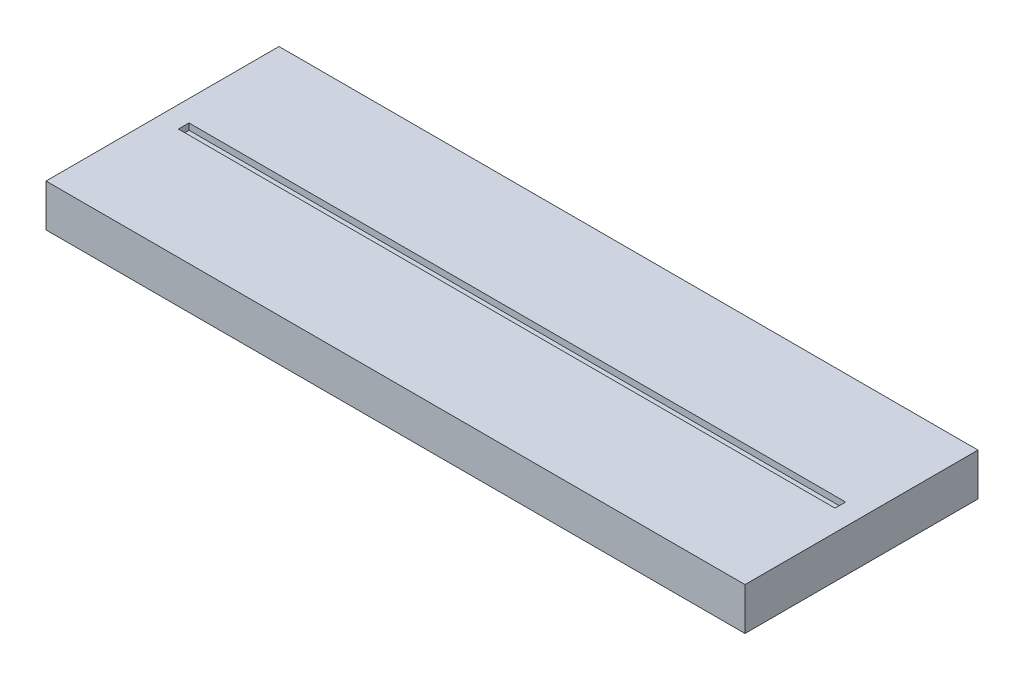
ISO-10303-21;
HEADER;
FILE_DESCRIPTION(('STEP AP214'),'2;1');
FILE_NAME('part.step','',(''),(''),'','','');
FILE_SCHEMA(('AUTOMOTIVE_DESIGN { 1 0 10303 214 1 1 1 1 }'));
ENDSEC;
DATA;
#1=APPLICATION_CONTEXT('core data for automotive mechanical design processes');
#2=APPLICATION_PROTOCOL_DEFINITION('international standard','automotive_design',2000,#1);
#3=PRODUCT_CONTEXT('',#1,'mechanical');
#4=PRODUCT('Part','Part','',(#3));
#5=PRODUCT_RELATED_PRODUCT_CATEGORY('part','',(#4));
#6=PRODUCT_DEFINITION_FORMATION('','',#4);
#7=PRODUCT_DEFINITION_CONTEXT('part definition',#1,'design');
#8=PRODUCT_DEFINITION('design','',#6,#7);
#9=PRODUCT_DEFINITION_SHAPE('','',#8);
#10=(LENGTH_UNIT() NAMED_UNIT(*) SI_UNIT(.MILLI.,.METRE.));
#11=(NAMED_UNIT(*) PLANE_ANGLE_UNIT() SI_UNIT($,.RADIAN.));
#12=(NAMED_UNIT(*) SI_UNIT($,.STERADIAN.) SOLID_ANGLE_UNIT());
#13=UNCERTAINTY_MEASURE_WITH_UNIT(LENGTH_MEASURE(1.E-05),#10,'distance_accuracy_value','');
#14=(GEOMETRIC_REPRESENTATION_CONTEXT(3) GLOBAL_UNCERTAINTY_ASSIGNED_CONTEXT((#13)) GLOBAL_UNIT_ASSIGNED_CONTEXT((#10,
#11,#12)) REPRESENTATION_CONTEXT('',''));
#15=CARTESIAN_POINT('',(0.,0.,0.));
#16=DIRECTION('',(0.,0.,1.));
#17=DIRECTION('',(1.,0.,0.));
#18=AXIS2_PLACEMENT_3D('',#15,#16,#17);
#19=CARTESIAN_POINT('',(82.5,10.,27.5));
#20=DIRECTION('',(-1.,0.,0.));
#21=DIRECTION('',(0.,0.,1.));
#22=AXIS2_PLACEMENT_3D('',#19,#20,#21);
#23=PLANE('',#22);
#24=DIRECTION('',(0.,0.,-1.));
#25=VECTOR('',#24,1.);
#26=CARTESIAN_POINT('',(82.5,0.,27.5));
#27=LINE('',#26,#25);
#28=CARTESIAN_POINT('',(82.5,0.,27.5));
#29=VERTEX_POINT('',#28);
#30=CARTESIAN_POINT('',(82.5,0.,-27.5));
#31=VERTEX_POINT('',#30);
#32=EDGE_CURVE('E163',#29,#31,#27,.T.);
#33=ORIENTED_EDGE('',*,*,#32,.T.);
#34=DIRECTION('',(0.,-1.,0.));
#35=VECTOR('',#34,1.);
#36=CARTESIAN_POINT('',(82.5,10.,-27.5));
#37=LINE('',#36,#35);
#38=CARTESIAN_POINT('',(82.5,10.,-27.5));
#39=VERTEX_POINT('',#38);
#40=EDGE_CURVE('E11',#39,#31,#37,.T.);
#41=ORIENTED_EDGE('',*,*,#40,.F.);
#42=DIRECTION('',(0.,0.,-1.));
#43=VECTOR('',#42,1.);
#44=CARTESIAN_POINT('',(82.5,10.,27.5));
#45=LINE('',#44,#43);
#46=CARTESIAN_POINT('',(82.5,10.,27.5));
#47=VERTEX_POINT('',#46);
#48=EDGE_CURVE('E168',#47,#39,#45,.T.);
#49=ORIENTED_EDGE('',*,*,#48,.F.);
#50=DIRECTION('',(0.,-1.,0.));
#51=VECTOR('',#50,1.);
#52=CARTESIAN_POINT('',(82.5,10.,27.5));
#53=LINE('',#52,#51);
#54=EDGE_CURVE('E176',#47,#29,#53,.T.);
#55=ORIENTED_EDGE('',*,*,#54,.T.);
#56=EDGE_LOOP('',(#33,#41,#49,#55));
#57=FACE_BOUND('',#56,.T.);
#58=ADVANCED_FACE('F44',(#57),#23,.F.);
#59=CARTESIAN_POINT('',(-82.5,10.,-27.5));
#60=DIRECTION('',(0.,0.,1.));
#61=DIRECTION('',(1.,0.,0.));
#62=AXIS2_PLACEMENT_3D('',#59,#60,#61);
#63=PLANE('',#62);
#64=DIRECTION('',(-1.,0.,0.));
#65=VECTOR('',#64,1.);
#66=CARTESIAN_POINT('',(-82.5,0.,-27.5));
#67=LINE('',#66,#65);
#68=CARTESIAN_POINT('',(-82.5,0.,-27.5));
#69=VERTEX_POINT('',#68);
#70=EDGE_CURVE('E184',#31,#69,#67,.T.);
#71=ORIENTED_EDGE('',*,*,#70,.T.);
#72=DIRECTION('',(0.,-1.,0.));
#73=VECTOR('',#72,1.);
#74=CARTESIAN_POINT('',(-82.5,10.,-27.5));
#75=LINE('',#74,#73);
#76=CARTESIAN_POINT('',(-82.5,10.,-27.5));
#77=VERTEX_POINT('',#76);
#78=EDGE_CURVE('E52',#77,#69,#75,.T.);
#79=ORIENTED_EDGE('',*,*,#78,.F.);
#80=DIRECTION('',(-1.,0.,0.));
#81=VECTOR('',#80,1.);
#82=CARTESIAN_POINT('',(-82.5,10.,-27.5));
#83=LINE('',#82,#81);
#84=EDGE_CURVE('E100',#39,#77,#83,.T.);
#85=ORIENTED_EDGE('',*,*,#84,.F.);
#86=ORIENTED_EDGE('',*,*,#40,.T.);
#87=EDGE_LOOP('',(#71,#79,#85,#86));
#88=FACE_BOUND('',#87,.T.);
#89=ADVANCED_FACE('F219',(#88),#63,.F.);
#90=CARTESIAN_POINT('',(-82.5,10.,27.5));
#91=DIRECTION('',(1.,0.,0.));
#92=DIRECTION('',(0.,0.,-1.));
#93=AXIS2_PLACEMENT_3D('',#90,#91,#92);
#94=PLANE('',#93);
#95=DIRECTION('',(0.,0.,1.));
#96=VECTOR('',#95,1.);
#97=CARTESIAN_POINT('',(-82.5,0.,27.5));
#98=LINE('',#97,#96);
#99=CARTESIAN_POINT('',(-82.5,0.,27.5));
#100=VERTEX_POINT('',#99);
#101=EDGE_CURVE('E186',#69,#100,#98,.T.);
#102=ORIENTED_EDGE('',*,*,#101,.T.);
#103=DIRECTION('',(0.,-1.,0.));
#104=VECTOR('',#103,1.);
#105=CARTESIAN_POINT('',(-82.5,10.,27.5));
#106=LINE('',#105,#104);
#107=CARTESIAN_POINT('',(-82.5,10.,27.5));
#108=VERTEX_POINT('',#107);
#109=EDGE_CURVE('E194',#108,#100,#106,.T.);
#110=ORIENTED_EDGE('',*,*,#109,.F.);
#111=DIRECTION('',(0.,0.,1.));
#112=VECTOR('',#111,1.);
#113=CARTESIAN_POINT('',(-82.5,10.,27.5));
#114=LINE('',#113,#112);
#115=EDGE_CURVE('E172',#77,#108,#114,.T.);
#116=ORIENTED_EDGE('',*,*,#115,.F.);
#117=ORIENTED_EDGE('',*,*,#78,.T.);
#118=EDGE_LOOP('',(#102,#110,#116,#117));
#119=FACE_BOUND('',#118,.T.);
#120=ADVANCED_FACE('F203',(#119),#94,.F.);
#121=CARTESIAN_POINT('',(-82.5,10.,27.5));
#122=DIRECTION('',(0.,0.,-1.));
#123=DIRECTION('',(-1.,0.,0.));
#124=AXIS2_PLACEMENT_3D('',#121,#122,#123);
#125=PLANE('',#124);
#126=DIRECTION('',(1.,0.,0.));
#127=VECTOR('',#126,1.);
#128=CARTESIAN_POINT('',(-82.5,0.,27.5));
#129=LINE('',#128,#127);
#130=EDGE_CURVE('E89',#100,#29,#129,.T.);
#131=ORIENTED_EDGE('',*,*,#130,.T.);
#132=ORIENTED_EDGE('',*,*,#54,.F.);
#133=DIRECTION('',(1.,0.,0.));
#134=VECTOR('',#133,1.);
#135=CARTESIAN_POINT('',(-82.5,10.,27.5));
#136=LINE('',#135,#134);
#137=EDGE_CURVE('E69',#108,#47,#136,.T.);
#138=ORIENTED_EDGE('',*,*,#137,.F.);
#139=ORIENTED_EDGE('',*,*,#109,.T.);
#140=EDGE_LOOP('',(#131,#132,#138,#139));
#141=FACE_BOUND('',#140,.T.);
#142=ADVANCED_FACE('F207',(#141),#125,.F.);
#143=CARTESIAN_POINT('',(0.,10.,0.));
#144=DIRECTION('',(0.,-1.,0.));
#145=DIRECTION('',(0.,0.,-1.));
#146=AXIS2_PLACEMENT_3D('',#143,#144,#145);
#147=PLANE('',#146);
#148=DIRECTION('',(1.,0.,0.));
#149=VECTOR('',#148,1.);
#150=CARTESIAN_POINT('',(-77.5,10.,1.25));
#151=LINE('',#150,#149);
#152=CARTESIAN_POINT('',(-77.5,10.,1.25));
#153=VERTEX_POINT('',#152);
#154=CARTESIAN_POINT('',(77.5,10.,1.25));
#155=VERTEX_POINT('',#154);
#156=EDGE_CURVE('E154',#153,#155,#151,.T.);
#157=ORIENTED_EDGE('',*,*,#156,.F.);
#158=DIRECTION('',(0.,0.,1.));
#159=VECTOR('',#158,1.);
#160=CARTESIAN_POINT('',(-77.5,10.,-1.25));
#161=LINE('',#160,#159);
#162=CARTESIAN_POINT('',(-77.5,10.,-1.25));
#163=VERTEX_POINT('',#162);
#164=EDGE_CURVE('E58',#163,#153,#161,.T.);
#165=ORIENTED_EDGE('',*,*,#164,.F.);
#166=DIRECTION('',(-1.,0.,0.));
#167=VECTOR('',#166,1.);
#168=CARTESIAN_POINT('',(77.5,10.,-1.25));
#169=LINE('',#168,#167);
#170=CARTESIAN_POINT('',(77.5,10.,-1.25));
#171=VERTEX_POINT('',#170);
#172=EDGE_CURVE('E142',#171,#163,#169,.T.);
#173=ORIENTED_EDGE('',*,*,#172,.F.);
#174=DIRECTION('',(0.,0.,-1.));
#175=VECTOR('',#174,1.);
#176=CARTESIAN_POINT('',(77.5,10.,1.25));
#177=LINE('',#176,#175);
#178=EDGE_CURVE('E148',#155,#171,#177,.T.);
#179=ORIENTED_EDGE('',*,*,#178,.F.);
#180=EDGE_LOOP('',(#157,#165,#173,#179));
#181=FACE_BOUND('',#180,.T.);
#182=ORIENTED_EDGE('',*,*,#48,.T.);
#183=ORIENTED_EDGE('',*,*,#84,.T.);
#184=ORIENTED_EDGE('',*,*,#115,.T.);
#185=ORIENTED_EDGE('',*,*,#137,.T.);
#186=EDGE_LOOP('',(#182,#183,#184,#185));
#187=FACE_BOUND('',#186,.T.);
#188=ADVANCED_FACE('F211',(#181,#187),#147,.F.);
#189=CARTESIAN_POINT('',(0.,0.,0.));
#190=DIRECTION('',(0.,-1.,0.));
#191=DIRECTION('',(0.,0.,-1.));
#192=AXIS2_PLACEMENT_3D('',#189,#190,#191);
#193=PLANE('',#192);
#194=ORIENTED_EDGE('',*,*,#32,.F.);
#195=ORIENTED_EDGE('',*,*,#130,.F.);
#196=ORIENTED_EDGE('',*,*,#101,.F.);
#197=ORIENTED_EDGE('',*,*,#70,.F.);
#198=EDGE_LOOP('',(#194,#195,#196,#197));
#199=FACE_BOUND('',#198,.T.);
#200=ADVANCED_FACE('F202',(#199),#193,.T.);
#201=CARTESIAN_POINT('',(-77.5,8.5,-1.25));
#202=DIRECTION('',(-1.,0.,0.));
#203=DIRECTION('',(0.,0.,1.));
#204=AXIS2_PLACEMENT_3D('',#201,#202,#203);
#205=PLANE('',#204);
#206=ORIENTED_EDGE('',*,*,#164,.T.);
#207=DIRECTION('',(0.,1.,0.));
#208=VECTOR('',#207,1.);
#209=CARTESIAN_POINT('',(-77.5,8.5,1.25));
#210=LINE('',#209,#208);
#211=CARTESIAN_POINT('',(-77.5,8.5,1.25));
#212=VERTEX_POINT('',#211);
#213=EDGE_CURVE('E116',#212,#153,#210,.T.);
#214=ORIENTED_EDGE('',*,*,#213,.F.);
#215=DIRECTION('',(0.,0.,1.));
#216=VECTOR('',#215,1.);
#217=CARTESIAN_POINT('',(-77.5,8.5,-1.25));
#218=LINE('',#217,#216);
#219=CARTESIAN_POINT('',(-77.5,8.5,-1.25));
#220=VERTEX_POINT('',#219);
#221=EDGE_CURVE('E122',#220,#212,#218,.T.);
#222=ORIENTED_EDGE('',*,*,#221,.F.);
#223=DIRECTION('',(0.,1.,0.));
#224=VECTOR('',#223,1.);
#225=CARTESIAN_POINT('',(-77.5,8.5,-1.25));
#226=LINE('',#225,#224);
#227=EDGE_CURVE('E161',#220,#163,#226,.T.);
#228=ORIENTED_EDGE('',*,*,#227,.T.);
#229=EDGE_LOOP('',(#206,#214,#222,#228));
#230=FACE_BOUND('',#229,.T.);
#231=ADVANCED_FACE('F118',(#230),#205,.F.);
#232=CARTESIAN_POINT('',(77.5,8.5,-1.25));
#233=DIRECTION('',(0.,0.,-1.));
#234=DIRECTION('',(-1.,0.,0.));
#235=AXIS2_PLACEMENT_3D('',#232,#233,#234);
#236=PLANE('',#235);
#237=ORIENTED_EDGE('',*,*,#172,.T.);
#238=ORIENTED_EDGE('',*,*,#227,.F.);
#239=DIRECTION('',(-1.,0.,0.));
#240=VECTOR('',#239,1.);
#241=CARTESIAN_POINT('',(77.5,8.5,-1.25));
#242=LINE('',#241,#240);
#243=CARTESIAN_POINT('',(77.5,8.5,-1.25));
#244=VERTEX_POINT('',#243);
#245=EDGE_CURVE('E126',#244,#220,#242,.T.);
#246=ORIENTED_EDGE('',*,*,#245,.F.);
#247=DIRECTION('',(0.,1.,0.));
#248=VECTOR('',#247,1.);
#249=CARTESIAN_POINT('',(77.5,8.5,-1.25));
#250=LINE('',#249,#248);
#251=EDGE_CURVE('E164',#244,#171,#250,.T.);
#252=ORIENTED_EDGE('',*,*,#251,.T.);
#253=EDGE_LOOP('',(#237,#238,#246,#252));
#254=FACE_BOUND('',#253,.T.);
#255=ADVANCED_FACE('F257',(#254),#236,.F.);
#256=CARTESIAN_POINT('',(77.5,8.5,1.25));
#257=DIRECTION('',(1.,0.,0.));
#258=DIRECTION('',(0.,0.,-1.));
#259=AXIS2_PLACEMENT_3D('',#256,#257,#258);
#260=PLANE('',#259);
#261=ORIENTED_EDGE('',*,*,#178,.T.);
#262=ORIENTED_EDGE('',*,*,#251,.F.);
#263=DIRECTION('',(0.,0.,-1.));
#264=VECTOR('',#263,1.);
#265=CARTESIAN_POINT('',(77.5,8.5,1.25));
#266=LINE('',#265,#264);
#267=CARTESIAN_POINT('',(77.5,8.5,1.25));
#268=VERTEX_POINT('',#267);
#269=EDGE_CURVE('E140',#268,#244,#266,.T.);
#270=ORIENTED_EDGE('',*,*,#269,.F.);
#271=DIRECTION('',(0.,1.,0.));
#272=VECTOR('',#271,1.);
#273=CARTESIAN_POINT('',(77.5,8.5,1.25));
#274=LINE('',#273,#272);
#275=EDGE_CURVE('E130',#268,#155,#274,.T.);
#276=ORIENTED_EDGE('',*,*,#275,.T.);
#277=EDGE_LOOP('',(#261,#262,#270,#276));
#278=FACE_BOUND('',#277,.T.);
#279=ADVANCED_FACE('F267',(#278),#260,.F.);
#280=CARTESIAN_POINT('',(-77.5,8.5,1.25));
#281=DIRECTION('',(0.,0.,1.));
#282=DIRECTION('',(1.,0.,0.));
#283=AXIS2_PLACEMENT_3D('',#280,#281,#282);
#284=PLANE('',#283);
#285=ORIENTED_EDGE('',*,*,#156,.T.);
#286=ORIENTED_EDGE('',*,*,#275,.F.);
#287=DIRECTION('',(1.,0.,0.));
#288=VECTOR('',#287,1.);
#289=CARTESIAN_POINT('',(-77.5,8.5,1.25));
#290=LINE('',#289,#288);
#291=EDGE_CURVE('E134',#212,#268,#290,.T.);
#292=ORIENTED_EDGE('',*,*,#291,.F.);
#293=ORIENTED_EDGE('',*,*,#213,.T.);
#294=EDGE_LOOP('',(#285,#286,#292,#293));
#295=FACE_BOUND('',#294,.T.);
#296=ADVANCED_FACE('F131',(#295),#284,.F.);
#297=CARTESIAN_POINT('',(0.,8.5,0.));
#298=DIRECTION('',(0.,1.,0.));
#299=DIRECTION('',(0.,0.,1.));
#300=AXIS2_PLACEMENT_3D('',#297,#298,#299);
#301=PLANE('',#300);
#302=ORIENTED_EDGE('',*,*,#221,.T.);
#303=ORIENTED_EDGE('',*,*,#291,.T.);
#304=ORIENTED_EDGE('',*,*,#269,.T.);
#305=ORIENTED_EDGE('',*,*,#245,.T.);
#306=EDGE_LOOP('',(#302,#303,#304,#305));
#307=FACE_BOUND('',#306,.T.);
#308=ADVANCED_FACE('F139',(#307),#301,.T.);
#309=CLOSED_SHELL('',(#58,#89,#120,#142,#188,#200,#231,#255,#279,#296,#308));
#310=MANIFOLD_SOLID_BREP('B2',#309);
#311=ADVANCED_BREP_SHAPE_REPRESENTATION('',(#18,#310),#14);
#312=SHAPE_DEFINITION_REPRESENTATION(#9,#311);
ENDSEC;
END-ISO-10303-21;
